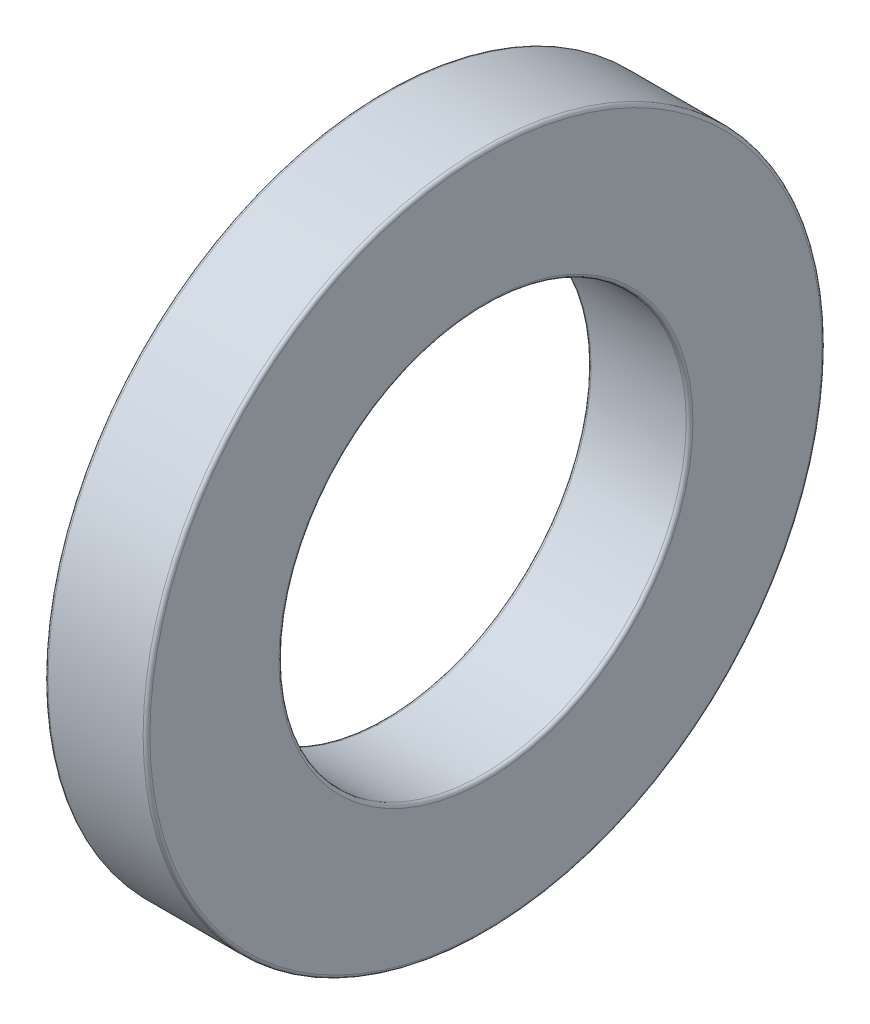
ISO-10303-21;
HEADER;
FILE_DESCRIPTION(('STEP AP214'),'2;1');
FILE_NAME('part.step','',(''),(''),'','','');
FILE_SCHEMA(('AUTOMOTIVE_DESIGN { 1 0 10303 214 1 1 1 1 }'));
ENDSEC;
DATA;
#1=APPLICATION_CONTEXT('core data for automotive mechanical design processes');
#2=APPLICATION_PROTOCOL_DEFINITION('international standard','automotive_design',2000,#1);
#3=PRODUCT_CONTEXT('',#1,'mechanical');
#4=PRODUCT('Part','Part','',(#3));
#5=PRODUCT_RELATED_PRODUCT_CATEGORY('part','',(#4));
#6=PRODUCT_DEFINITION_FORMATION('','',#4);
#7=PRODUCT_DEFINITION_CONTEXT('part definition',#1,'design');
#8=PRODUCT_DEFINITION('design','',#6,#7);
#9=PRODUCT_DEFINITION_SHAPE('','',#8);
#10=(LENGTH_UNIT() NAMED_UNIT(*) SI_UNIT(.MILLI.,.METRE.));
#11=(NAMED_UNIT(*) PLANE_ANGLE_UNIT() SI_UNIT($,.RADIAN.));
#12=(NAMED_UNIT(*) SI_UNIT($,.STERADIAN.) SOLID_ANGLE_UNIT());
#13=UNCERTAINTY_MEASURE_WITH_UNIT(LENGTH_MEASURE(1.E-05),#10,'distance_accuracy_value','');
#14=(GEOMETRIC_REPRESENTATION_CONTEXT(3) GLOBAL_UNCERTAINTY_ASSIGNED_CONTEXT((#13)) GLOBAL_UNIT_ASSIGNED_CONTEXT((#10,
#11,#12)) REPRESENTATION_CONTEXT('',''));
#15=CARTESIAN_POINT('',(0.,0.,0.));
#16=DIRECTION('',(0.,0.,1.));
#17=DIRECTION('',(1.,0.,0.));
#18=AXIS2_PLACEMENT_3D('',#15,#16,#17);
#19=CARTESIAN_POINT('',(1.5,0.,0.));
#20=DIRECTION('',(1.,0.,0.));
#21=DIRECTION('',(0.,0.,-1.));
#22=AXIS2_PLACEMENT_3D('',#19,#20,#21);
#23=PLANE('',#22);
#24=CARTESIAN_POINT('',(1.5,0.,0.));
#25=DIRECTION('',(1.,0.,0.));
#26=DIRECTION('',(0.,0.,-1.));
#27=AXIS2_PLACEMENT_3D('',#24,#25,#26);
#28=CIRCLE('',#27,3.05);
#29=CARTESIAN_POINT('',(1.5,0.,-3.05));
#30=VERTEX_POINT('',#29);
#31=EDGE_CURVE('E10',#30,#30,#28,.F.);
#32=ORIENTED_EDGE('',*,*,#31,.T.);
#33=EDGE_LOOP('',(#32));
#34=FACE_BOUND('',#33,.T.);
#35=CARTESIAN_POINT('',(1.5,0.,0.));
#36=DIRECTION('',(1.,0.,0.));
#37=DIRECTION('',(0.,0.,-1.));
#38=AXIS2_PLACEMENT_3D('',#35,#36,#37);
#39=CIRCLE('',#38,4.95);
#40=CARTESIAN_POINT('',(1.5,0.,-4.95));
#41=VERTEX_POINT('',#40);
#42=EDGE_CURVE('E38',#41,#41,#39,.T.);
#43=ORIENTED_EDGE('',*,*,#42,.T.);
#44=EDGE_LOOP('',(#43));
#45=FACE_BOUND('',#44,.T.);
#46=ADVANCED_FACE('F31',(#34,#45),#23,.T.);
#47=CARTESIAN_POINT('',(0.,0.,0.));
#48=DIRECTION('',(1.,0.,0.));
#49=DIRECTION('',(0.,0.,-1.));
#50=AXIS2_PLACEMENT_3D('',#47,#48,#49);
#51=PLANE('',#50);
#52=CARTESIAN_POINT('',(0.,0.,0.));
#53=DIRECTION('',(1.,0.,0.));
#54=DIRECTION('',(0.,0.,-1.));
#55=AXIS2_PLACEMENT_3D('',#52,#53,#54);
#56=CIRCLE('',#55,4.95);
#57=CARTESIAN_POINT('',(0.,0.,-4.95));
#58=VERTEX_POINT('',#57);
#59=EDGE_CURVE('E51',#58,#58,#56,.F.);
#60=ORIENTED_EDGE('',*,*,#59,.T.);
#61=EDGE_LOOP('',(#60));
#62=FACE_BOUND('',#61,.T.);
#63=CARTESIAN_POINT('',(0.,0.,0.));
#64=DIRECTION('',(1.,0.,0.));
#65=DIRECTION('',(0.,0.,-1.));
#66=AXIS2_PLACEMENT_3D('',#63,#64,#65);
#67=CIRCLE('',#66,3.05);
#68=CARTESIAN_POINT('',(0.,0.,-3.05));
#69=VERTEX_POINT('',#68);
#70=EDGE_CURVE('E54',#69,#69,#67,.T.);
#71=ORIENTED_EDGE('',*,*,#70,.T.);
#72=EDGE_LOOP('',(#71));
#73=FACE_BOUND('',#72,.T.);
#74=ADVANCED_FACE('F75',(#62,#73),#51,.F.);
#75=CARTESIAN_POINT('',(1.5,0.,0.));
#76=DIRECTION('',(-1.,0.,0.));
#77=DIRECTION('',(0.,0.,1.));
#78=AXIS2_PLACEMENT_3D('',#75,#76,#77);
#79=CYLINDRICAL_SURFACE('',#78,5.);
#80=CARTESIAN_POINT('',(0.0499999999999999,0.,0.));
#81=DIRECTION('',(1.,0.,0.));
#82=DIRECTION('',(0.,0.,-1.));
#83=AXIS2_PLACEMENT_3D('',#80,#81,#82);
#84=CIRCLE('',#83,5.);
#85=CARTESIAN_POINT('',(0.0499999999999999,0.,-5.));
#86=VERTEX_POINT('',#85);
#87=EDGE_CURVE('E57',#86,#86,#84,.T.);
#88=ORIENTED_EDGE('',*,*,#87,.T.);
#89=EDGE_LOOP('',(#88));
#90=FACE_BOUND('',#89,.T.);
#91=CARTESIAN_POINT('',(1.45,0.,0.));
#92=DIRECTION('',(1.,0.,0.));
#93=DIRECTION('',(0.,0.,-1.));
#94=AXIS2_PLACEMENT_3D('',#91,#92,#93);
#95=CIRCLE('',#94,5.);
#96=CARTESIAN_POINT('',(1.45,0.,-5.));
#97=VERTEX_POINT('',#96);
#98=EDGE_CURVE('E60',#97,#97,#95,.F.);
#99=ORIENTED_EDGE('',*,*,#98,.T.);
#100=EDGE_LOOP('',(#99));
#101=FACE_BOUND('',#100,.T.);
#102=ADVANCED_FACE('F64',(#90,#101),#79,.T.);
#103=CARTESIAN_POINT('',(1.5,0.,0.));
#104=DIRECTION('',(-1.,0.,0.));
#105=DIRECTION('',(0.,0.,1.));
#106=AXIS2_PLACEMENT_3D('',#103,#104,#105);
#107=CYLINDRICAL_SURFACE('',#106,3.);
#108=CARTESIAN_POINT('',(0.0499999999999999,0.,0.));
#109=DIRECTION('',(1.,0.,0.));
#110=DIRECTION('',(0.,0.,-1.));
#111=AXIS2_PLACEMENT_3D('',#108,#109,#110);
#112=CIRCLE('',#111,3.);
#113=CARTESIAN_POINT('',(0.0499999999999999,0.,-3.));
#114=VERTEX_POINT('',#113);
#115=EDGE_CURVE('E42',#114,#114,#112,.F.);
#116=ORIENTED_EDGE('',*,*,#115,.T.);
#117=EDGE_LOOP('',(#116));
#118=FACE_BOUND('',#117,.T.);
#119=CARTESIAN_POINT('',(1.45,0.,0.));
#120=DIRECTION('',(1.,0.,0.));
#121=DIRECTION('',(0.,0.,-1.));
#122=AXIS2_PLACEMENT_3D('',#119,#120,#121);
#123=CIRCLE('',#122,3.);
#124=CARTESIAN_POINT('',(1.45,0.,-3.));
#125=VERTEX_POINT('',#124);
#126=EDGE_CURVE('E46',#125,#125,#123,.T.);
#127=ORIENTED_EDGE('',*,*,#126,.T.);
#128=EDGE_LOOP('',(#127));
#129=FACE_BOUND('',#128,.T.);
#130=ADVANCED_FACE('F83',(#118,#129),#107,.F.);
#131=CARTESIAN_POINT('',(0.0499999999999999,0.,0.));
#132=DIRECTION('',(1.,0.,0.));
#133=DIRECTION('',(0.,0.,-1.));
#134=AXIS2_PLACEMENT_3D('',#131,#132,#133);
#135=TOROIDAL_SURFACE('',#134,4.95,0.05);
#136=ORIENTED_EDGE('',*,*,#59,.F.);
#137=EDGE_LOOP('',(#136));
#138=FACE_BOUND('',#137,.T.);
#139=ORIENTED_EDGE('',*,*,#87,.F.);
#140=EDGE_LOOP('',(#139));
#141=FACE_BOUND('',#140,.T.);
#142=ADVANCED_FACE('F88',(#138,#141),#135,.T.);
#143=CARTESIAN_POINT('',(0.0499999999999999,0.,0.));
#144=DIRECTION('',(1.,0.,0.));
#145=DIRECTION('',(0.,0.,-1.));
#146=AXIS2_PLACEMENT_3D('',#143,#144,#145);
#147=TOROIDAL_SURFACE('',#146,3.05,0.05);
#148=ORIENTED_EDGE('',*,*,#115,.F.);
#149=EDGE_LOOP('',(#148));
#150=FACE_BOUND('',#149,.T.);
#151=ORIENTED_EDGE('',*,*,#70,.F.);
#152=EDGE_LOOP('',(#151));
#153=FACE_BOUND('',#152,.T.);
#154=ADVANCED_FACE('F72',(#150,#153),#147,.T.);
#155=CARTESIAN_POINT('',(1.45,0.,0.));
#156=DIRECTION('',(1.,0.,0.));
#157=DIRECTION('',(0.,0.,-1.));
#158=AXIS2_PLACEMENT_3D('',#155,#156,#157);
#159=TOROIDAL_SURFACE('',#158,3.05,0.05);
#160=ORIENTED_EDGE('',*,*,#31,.F.);
#161=EDGE_LOOP('',(#160));
#162=FACE_BOUND('',#161,.T.);
#163=ORIENTED_EDGE('',*,*,#126,.F.);
#164=EDGE_LOOP('',(#163));
#165=FACE_BOUND('',#164,.T.);
#166=ADVANCED_FACE('F68',(#162,#165),#159,.T.);
#167=CARTESIAN_POINT('',(1.45,0.,0.));
#168=DIRECTION('',(1.,0.,0.));
#169=DIRECTION('',(0.,0.,-1.));
#170=AXIS2_PLACEMENT_3D('',#167,#168,#169);
#171=TOROIDAL_SURFACE('',#170,4.95,0.05);
#172=ORIENTED_EDGE('',*,*,#98,.F.);
#173=EDGE_LOOP('',(#172));
#174=FACE_BOUND('',#173,.T.);
#175=ORIENTED_EDGE('',*,*,#42,.F.);
#176=EDGE_LOOP('',(#175));
#177=FACE_BOUND('',#176,.T.);
#178=ADVANCED_FACE('F33',(#174,#177),#171,.T.);
#179=CLOSED_SHELL('',(#46,#74,#102,#130,#142,#154,#166,#178));
#180=MANIFOLD_SOLID_BREP('B2',#179);
#181=ADVANCED_BREP_SHAPE_REPRESENTATION('',(#18,#180),#14);
#182=SHAPE_DEFINITION_REPRESENTATION(#9,#181);
ENDSEC;
END-ISO-10303-21;
